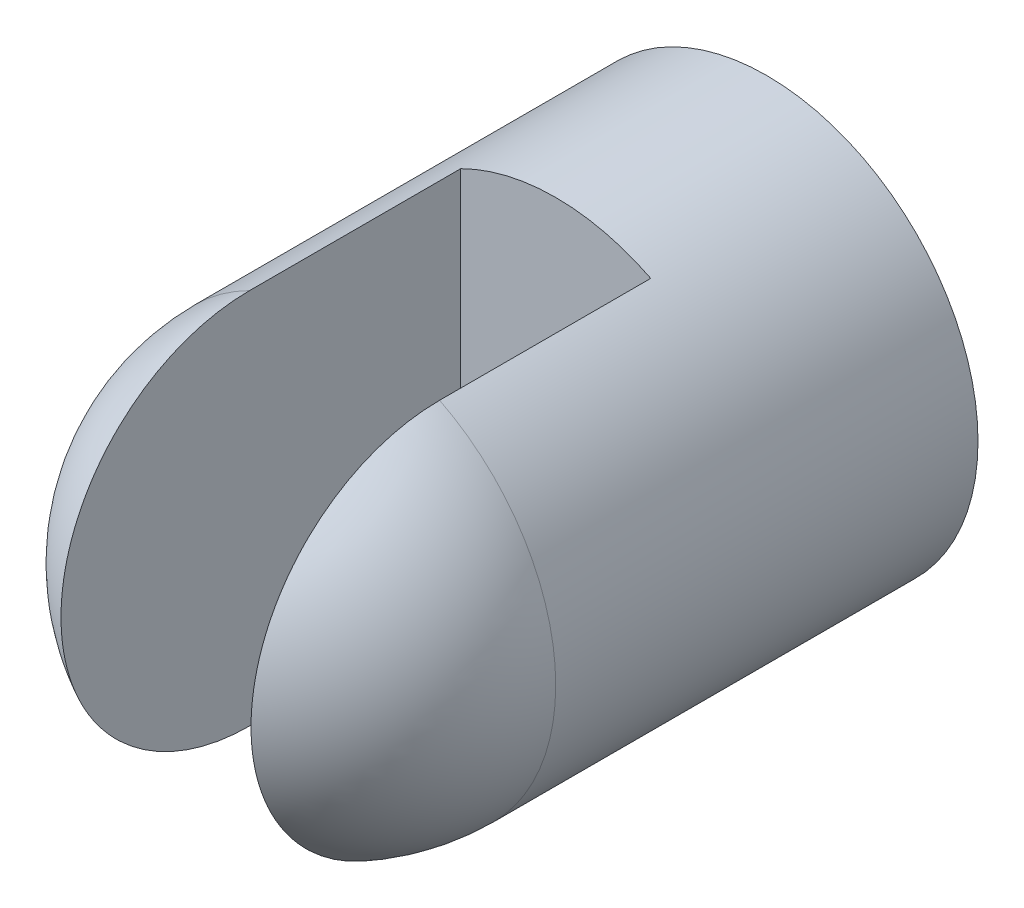
ISO-10303-21;
HEADER;
FILE_DESCRIPTION(('STEP AP214'),'2;1');
FILE_NAME('part.step','',(''),(''),'','','');
FILE_SCHEMA(('AUTOMOTIVE_DESIGN { 1 0 10303 214 1 1 1 1 }'));
ENDSEC;
DATA;
#1=APPLICATION_CONTEXT('core data for automotive mechanical design processes');
#2=APPLICATION_PROTOCOL_DEFINITION('international standard','automotive_design',2000,#1);
#3=PRODUCT_CONTEXT('',#1,'mechanical');
#4=PRODUCT('Part','Part','',(#3));
#5=PRODUCT_RELATED_PRODUCT_CATEGORY('part','',(#4));
#6=PRODUCT_DEFINITION_FORMATION('','',#4);
#7=PRODUCT_DEFINITION_CONTEXT('part definition',#1,'design');
#8=PRODUCT_DEFINITION('design','',#6,#7);
#9=PRODUCT_DEFINITION_SHAPE('','',#8);
#10=(LENGTH_UNIT() NAMED_UNIT(*) SI_UNIT(.MILLI.,.METRE.));
#11=(NAMED_UNIT(*) PLANE_ANGLE_UNIT() SI_UNIT($,.RADIAN.));
#12=(NAMED_UNIT(*) SI_UNIT($,.STERADIAN.) SOLID_ANGLE_UNIT());
#13=UNCERTAINTY_MEASURE_WITH_UNIT(LENGTH_MEASURE(1.E-05),#10,'distance_accuracy_value','');
#14=(GEOMETRIC_REPRESENTATION_CONTEXT(3) GLOBAL_UNCERTAINTY_ASSIGNED_CONTEXT((#13)) GLOBAL_UNIT_ASSIGNED_CONTEXT((#10,
#11,#12)) REPRESENTATION_CONTEXT('',''));
#15=CARTESIAN_POINT('',(0.,0.,0.));
#16=DIRECTION('',(0.,0.,1.));
#17=DIRECTION('',(1.,0.,0.));
#18=AXIS2_PLACEMENT_3D('',#15,#16,#17);
#19=CARTESIAN_POINT('',(0.,0.,200.));
#20=DIRECTION('',(0.,0.,1.));
#21=DIRECTION('',(1.,0.,0.));
#22=AXIS2_PLACEMENT_3D('',#19,#20,#21);
#23=SPHERICAL_SURFACE('',#22,100.);
#24=CARTESIAN_POINT('',(-45.,0.,200.));
#25=DIRECTION('',(-1.,0.,0.));
#26=DIRECTION('',(0.,0.,1.));
#27=AXIS2_PLACEMENT_3D('',#24,#25,#26);
#28=CIRCLE('',#27,89.3028554974588);
#29=CARTESIAN_POINT('',(-45.,89.3028554974588,200.));
#30=VERTEX_POINT('',#29);
#31=CARTESIAN_POINT('',(-45.,-89.3028554974588,200.));
#32=VERTEX_POINT('',#31);
#33=EDGE_CURVE('E62',#30,#32,#28,.F.);
#34=ORIENTED_EDGE('',*,*,#33,.F.);
#35=CARTESIAN_POINT('',(0.,0.,200.));
#36=DIRECTION('',(0.,0.,1.));
#37=DIRECTION('',(1.,0.,0.));
#38=AXIS2_PLACEMENT_3D('',#35,#36,#37);
#39=CIRCLE('',#38,100.);
#40=EDGE_CURVE('E110',#30,#32,#39,.T.);
#41=ORIENTED_EDGE('',*,*,#40,.T.);
#42=EDGE_LOOP('',(#34,#41));
#43=FACE_BOUND('',#42,.T.);
#44=ADVANCED_FACE('F37',(#43),#23,.T.);
#45=CARTESIAN_POINT('',(0.,0.,200.));
#46=DIRECTION('',(0.,0.,-1.));
#47=DIRECTION('',(-1.,0.,0.));
#48=AXIS2_PLACEMENT_3D('',#45,#46,#47);
#49=CYLINDRICAL_SURFACE('',#48,100.);
#50=ORIENTED_EDGE('',*,*,#40,.F.);
#51=DIRECTION('',(0.,0.,-1.));
#52=VECTOR('',#51,1.);
#53=CARTESIAN_POINT('',(-45.,89.3028554974588,200.));
#54=LINE('',#53,#52);
#55=CARTESIAN_POINT('',(-45.,89.3028554974588,100.));
#56=VERTEX_POINT('',#55);
#57=EDGE_CURVE('E100',#30,#56,#54,.T.);
#58=ORIENTED_EDGE('',*,*,#57,.T.);
#59=CARTESIAN_POINT('',(0.,0.,100.));
#60=DIRECTION('',(0.,0.,1.));
#61=DIRECTION('',(1.,0.,0.));
#62=AXIS2_PLACEMENT_3D('',#59,#60,#61);
#63=CIRCLE('',#62,100.);
#64=CARTESIAN_POINT('',(45.,89.3028554974588,100.));
#65=VERTEX_POINT('',#64);
#66=EDGE_CURVE('E46',#65,#56,#63,.T.);
#67=ORIENTED_EDGE('',*,*,#66,.F.);
#68=DIRECTION('',(0.,0.,-1.));
#69=VECTOR('',#68,1.);
#70=CARTESIAN_POINT('',(45.,89.3028554974588,200.));
#71=LINE('',#70,#69);
#72=CARTESIAN_POINT('',(45.,89.3028554974588,200.));
#73=VERTEX_POINT('',#72);
#74=EDGE_CURVE('E90',#65,#73,#71,.F.);
#75=ORIENTED_EDGE('',*,*,#74,.T.);
#76=CARTESIAN_POINT('',(45.,-89.3028554974588,200.));
#77=VERTEX_POINT('',#76);
#78=EDGE_CURVE('E97',#77,#73,#39,.T.);
#79=ORIENTED_EDGE('',*,*,#78,.F.);
#80=DIRECTION('',(0.,0.,-1.));
#81=VECTOR('',#80,1.);
#82=CARTESIAN_POINT('',(45.,-89.3028554974588,200.));
#83=LINE('',#82,#81);
#84=CARTESIAN_POINT('',(45.,-89.3028554974588,100.));
#85=VERTEX_POINT('',#84);
#86=EDGE_CURVE('E54',#77,#85,#83,.T.);
#87=ORIENTED_EDGE('',*,*,#86,.T.);
#88=CARTESIAN_POINT('',(-45.,-89.3028554974588,100.));
#89=VERTEX_POINT('',#88);
#90=EDGE_CURVE('E41',#89,#85,#63,.T.);
#91=ORIENTED_EDGE('',*,*,#90,.F.);
#92=DIRECTION('',(0.,0.,-1.));
#93=VECTOR('',#92,1.);
#94=CARTESIAN_POINT('',(-45.,-89.3028554974588,200.));
#95=LINE('',#94,#93);
#96=EDGE_CURVE('E98',#89,#32,#95,.F.);
#97=ORIENTED_EDGE('',*,*,#96,.T.);
#98=EDGE_LOOP('',(#50,#58,#67,#75,#79,#87,#91,#97));
#99=FACE_BOUND('',#98,.T.);
#100=CARTESIAN_POINT('',(0.,0.,0.));
#101=DIRECTION('',(0.,0.,1.));
#102=DIRECTION('',(1.,0.,0.));
#103=AXIS2_PLACEMENT_3D('',#100,#101,#102);
#104=CIRCLE('',#103,100.);
#105=CARTESIAN_POINT('',(100.,0.,0.));
#106=VERTEX_POINT('',#105);
#107=EDGE_CURVE('E106',#106,#106,#104,.T.);
#108=ORIENTED_EDGE('',*,*,#107,.T.);
#109=EDGE_LOOP('',(#108));
#110=FACE_BOUND('',#109,.T.);
#111=ADVANCED_FACE('F94',(#99,#110),#49,.T.);
#112=CARTESIAN_POINT('',(45.,0.,200.));
#113=DIRECTION('',(1.,0.,0.));
#114=DIRECTION('',(0.,0.,-1.));
#115=AXIS2_PLACEMENT_3D('',#112,#113,#114);
#116=CIRCLE('',#115,89.3028554974588);
#117=EDGE_CURVE('E111',#77,#73,#116,.F.);
#118=ORIENTED_EDGE('',*,*,#117,.F.);
#119=ORIENTED_EDGE('',*,*,#78,.T.);
#120=EDGE_LOOP('',(#118,#119));
#121=FACE_BOUND('',#120,.T.);
#122=ADVANCED_FACE('F39',(#121),#23,.T.);
#123=CARTESIAN_POINT('',(0.,0.,0.));
#124=DIRECTION('',(0.,0.,1.));
#125=DIRECTION('',(1.,0.,0.));
#126=AXIS2_PLACEMENT_3D('',#123,#124,#125);
#127=PLANE('',#126);
#128=CARTESIAN_POINT('',(0.,0.,0.));
#129=DIRECTION('',(0.,0.,-1.));
#130=DIRECTION('',(-1.,0.,0.));
#131=AXIS2_PLACEMENT_3D('',#128,#129,#130);
#132=CIRCLE('',#131,40.);
#133=CARTESIAN_POINT('',(-40.,0.,0.));
#134=VERTEX_POINT('',#133);
#135=EDGE_CURVE('E11',#134,#134,#132,.T.);
#136=ORIENTED_EDGE('',*,*,#135,.F.);
#137=EDGE_LOOP('',(#136));
#138=FACE_BOUND('',#137,.T.);
#139=ORIENTED_EDGE('',*,*,#107,.F.);
#140=EDGE_LOOP('',(#139));
#141=FACE_BOUND('',#140,.T.);
#142=ADVANCED_FACE('F129',(#138,#141),#127,.F.);
#143=CARTESIAN_POINT('',(0.,0.,100.));
#144=DIRECTION('',(0.,0.,1.));
#145=DIRECTION('',(1.,0.,0.));
#146=AXIS2_PLACEMENT_3D('',#143,#144,#145);
#147=PLANE('',#146);
#148=ORIENTED_EDGE('',*,*,#66,.T.);
#149=DIRECTION('',(0.,-1.,0.));
#150=VECTOR('',#149,1.);
#151=CARTESIAN_POINT('',(-45.,-110.540548399292,100.));
#152=LINE('',#151,#150);
#153=EDGE_CURVE('E86',#56,#89,#152,.T.);
#154=ORIENTED_EDGE('',*,*,#153,.T.);
#155=ORIENTED_EDGE('',*,*,#90,.T.);
#156=DIRECTION('',(0.,1.,0.));
#157=VECTOR('',#156,1.);
#158=CARTESIAN_POINT('',(45.,-110.540548399292,100.));
#159=LINE('',#158,#157);
#160=EDGE_CURVE('E83',#85,#65,#159,.T.);
#161=ORIENTED_EDGE('',*,*,#160,.T.);
#162=EDGE_LOOP('',(#148,#154,#155,#161));
#163=FACE_BOUND('',#162,.T.);
#164=ADVANCED_FACE('F82',(#163),#147,.T.);
#165=CARTESIAN_POINT('',(-45.,-110.540548399292,100.));
#166=DIRECTION('',(-1.,0.,0.));
#167=DIRECTION('',(0.,0.,1.));
#168=AXIS2_PLACEMENT_3D('',#165,#166,#167);
#169=PLANE('',#168);
#170=ORIENTED_EDGE('',*,*,#33,.T.);
#171=ORIENTED_EDGE('',*,*,#96,.F.);
#172=ORIENTED_EDGE('',*,*,#153,.F.);
#173=ORIENTED_EDGE('',*,*,#57,.F.);
#174=EDGE_LOOP('',(#170,#171,#172,#173));
#175=FACE_BOUND('',#174,.T.);
#176=ADVANCED_FACE('F114',(#175),#169,.F.);
#177=CARTESIAN_POINT('',(45.,-110.540548399292,100.));
#178=DIRECTION('',(1.,0.,0.));
#179=DIRECTION('',(0.,0.,-1.));
#180=AXIS2_PLACEMENT_3D('',#177,#178,#179);
#181=PLANE('',#180);
#182=ORIENTED_EDGE('',*,*,#117,.T.);
#183=ORIENTED_EDGE('',*,*,#74,.F.);
#184=ORIENTED_EDGE('',*,*,#160,.F.);
#185=ORIENTED_EDGE('',*,*,#86,.F.);
#186=EDGE_LOOP('',(#182,#183,#184,#185));
#187=FACE_BOUND('',#186,.T.);
#188=ADVANCED_FACE('F88',(#187),#181,.F.);
#189=CARTESIAN_POINT('',(0.,0.,-5.));
#190=DIRECTION('',(0.,0.,1.));
#191=DIRECTION('',(1.,0.,0.));
#192=AXIS2_PLACEMENT_3D('',#189,#190,#191);
#193=CYLINDRICAL_SURFACE('',#192,40.);
#194=CARTESIAN_POINT('',(0.,0.,-5.));
#195=DIRECTION('',(0.,0.,-1.));
#196=DIRECTION('',(-1.,0.,0.));
#197=AXIS2_PLACEMENT_3D('',#194,#195,#196);
#198=CIRCLE('',#197,40.);
#199=CARTESIAN_POINT('',(-40.,0.,-5.));
#200=VERTEX_POINT('',#199);
#201=EDGE_CURVE('E115',#200,#200,#198,.T.);
#202=ORIENTED_EDGE('',*,*,#201,.F.);
#203=EDGE_LOOP('',(#202));
#204=FACE_BOUND('',#203,.T.);
#205=ORIENTED_EDGE('',*,*,#135,.T.);
#206=EDGE_LOOP('',(#205));
#207=FACE_BOUND('',#206,.T.);
#208=ADVANCED_FACE('F123',(#204,#207),#193,.T.);
#209=CARTESIAN_POINT('',(0.,0.,-5.));
#210=DIRECTION('',(0.,0.,-1.));
#211=DIRECTION('',(-1.,0.,0.));
#212=AXIS2_PLACEMENT_3D('',#209,#210,#211);
#213=PLANE('',#212);
#214=ORIENTED_EDGE('',*,*,#201,.T.);
#215=EDGE_LOOP('',(#214));
#216=FACE_BOUND('',#215,.T.);
#217=ADVANCED_FACE('F121',(#216),#213,.T.);
#218=CLOSED_SHELL('',(#44,#111,#122,#142,#164,#176,#188,#208,#217));
#219=MANIFOLD_SOLID_BREP('B2',#218);
#220=ADVANCED_BREP_SHAPE_REPRESENTATION('',(#18,#219),#14);
#221=SHAPE_DEFINITION_REPRESENTATION(#9,#220);
ENDSEC;
END-ISO-10303-21;
